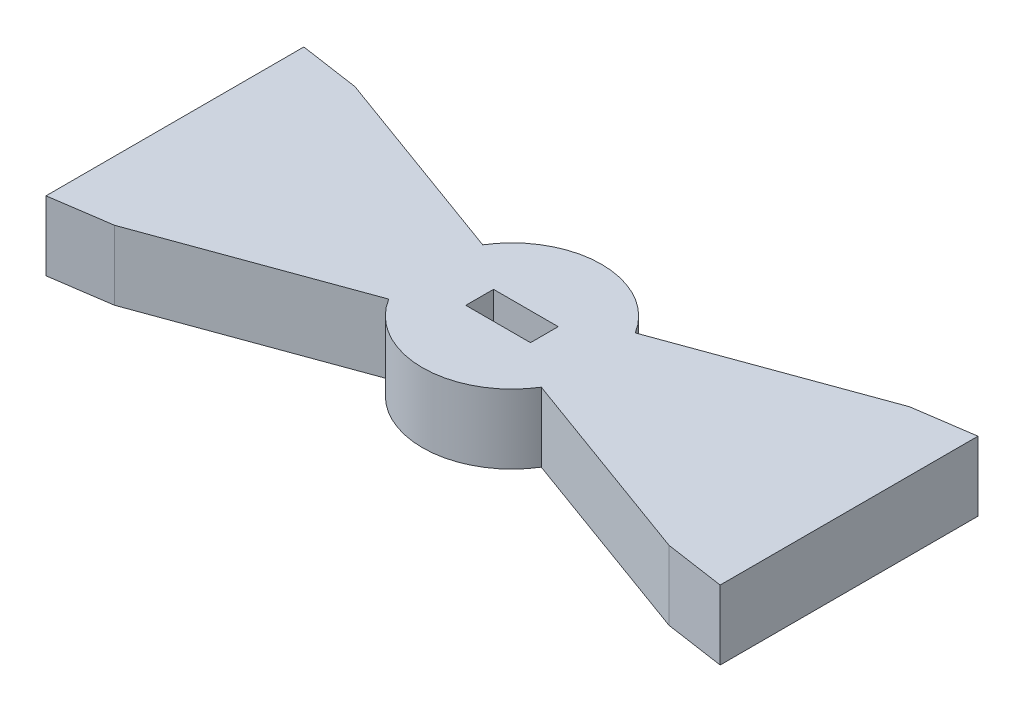
ISO-10303-21;
HEADER;
FILE_DESCRIPTION(('STEP AP214'),'2;1');
FILE_NAME('part.step','',(''),(''),'','','');
FILE_SCHEMA(('AUTOMOTIVE_DESIGN { 1 0 10303 214 1 1 1 1 }'));
ENDSEC;
DATA;
#1=APPLICATION_CONTEXT('core data for automotive mechanical design processes');
#2=APPLICATION_PROTOCOL_DEFINITION('international standard','automotive_design',2000,#1);
#3=PRODUCT_CONTEXT('',#1,'mechanical');
#4=PRODUCT('Part','Part','',(#3));
#5=PRODUCT_RELATED_PRODUCT_CATEGORY('part','',(#4));
#6=PRODUCT_DEFINITION_FORMATION('','',#4);
#7=PRODUCT_DEFINITION_CONTEXT('part definition',#1,'design');
#8=PRODUCT_DEFINITION('design','',#6,#7);
#9=PRODUCT_DEFINITION_SHAPE('','',#8);
#10=(LENGTH_UNIT() NAMED_UNIT(*) SI_UNIT(.MILLI.,.METRE.));
#11=(NAMED_UNIT(*) PLANE_ANGLE_UNIT() SI_UNIT($,.RADIAN.));
#12=(NAMED_UNIT(*) SI_UNIT($,.STERADIAN.) SOLID_ANGLE_UNIT());
#13=UNCERTAINTY_MEASURE_WITH_UNIT(LENGTH_MEASURE(1.E-05),#10,'distance_accuracy_value','');
#14=(GEOMETRIC_REPRESENTATION_CONTEXT(3) GLOBAL_UNCERTAINTY_ASSIGNED_CONTEXT((#13)) GLOBAL_UNIT_ASSIGNED_CONTEXT((#10,
#11,#12)) REPRESENTATION_CONTEXT('',''));
#15=CARTESIAN_POINT('',(0.,0.,0.));
#16=DIRECTION('',(0.,0.,1.));
#17=DIRECTION('',(1.,0.,0.));
#18=AXIS2_PLACEMENT_3D('',#15,#16,#17);
#19=CARTESIAN_POINT('',(0.169871671875798,1.905,0.466718582683769));
#20=DIRECTION('',(0.342020143325663,0.,0.939692620785911));
#21=DIRECTION('',(0.939692620785911,0.,-0.342020143325663));
#22=AXIS2_PLACEMENT_3D('',#19,#20,#21);
#23=PLANE('',#22);
#24=DIRECTION('',(-0.939692620785911,0.,0.342020143325663));
#25=VECTOR('',#24,1.);
#26=CARTESIAN_POINT('',(0.169871671875798,0.,0.466718582683769));
#27=LINE('',#26,#25);
#28=CARTESIAN_POINT('',(-2.09649020518056,0.,1.29160684600795));
#29=VERTEX_POINT('',#28);
#30=CARTESIAN_POINT('',(-7.62,0.,3.302));
#31=VERTEX_POINT('',#30);
#32=EDGE_CURVE('E185',#29,#31,#27,.T.);
#33=ORIENTED_EDGE('',*,*,#32,.F.);
#34=DIRECTION('',(0.,-1.,0.));
#35=VECTOR('',#34,1.);
#36=CARTESIAN_POINT('',(-2.09649020518056,1.905,1.29160684600795));
#37=LINE('',#36,#35);
#38=CARTESIAN_POINT('',(-2.09649020518056,1.905,1.29160684600795));
#39=VERTEX_POINT('',#38);
#40=EDGE_CURVE('E312',#39,#29,#37,.T.);
#41=ORIENTED_EDGE('',*,*,#40,.F.);
#42=DIRECTION('',(-0.939692620785911,0.,0.342020143325663));
#43=VECTOR('',#42,1.);
#44=CARTESIAN_POINT('',(0.169871671875798,1.905,0.466718582683769));
#45=LINE('',#44,#43);
#46=CARTESIAN_POINT('',(-7.62,1.905,3.302));
#47=VERTEX_POINT('',#46);
#48=EDGE_CURVE('E190',#39,#47,#45,.T.);
#49=ORIENTED_EDGE('',*,*,#48,.T.);
#50=DIRECTION('',(0.,-1.,0.));
#51=VECTOR('',#50,1.);
#52=CARTESIAN_POINT('',(-7.62,1.905,3.302));
#53=LINE('',#52,#51);
#54=EDGE_CURVE('E233',#47,#31,#53,.T.);
#55=ORIENTED_EDGE('',*,*,#54,.T.);
#56=EDGE_LOOP('',(#33,#41,#49,#55));
#57=FACE_BOUND('',#56,.T.);
#58=ADVANCED_FACE('F41',(#57),#23,.T.);
#59=CARTESIAN_POINT('',(0.,1.905,0.));
#60=DIRECTION('',(0.,-1.,0.));
#61=DIRECTION('',(0.,0.,-1.));
#62=AXIS2_PLACEMENT_3D('',#59,#60,#61);
#63=CYLINDRICAL_SURFACE('',#62,2.46242145561491);
#64=CARTESIAN_POINT('',(0.,0.,0.));
#65=DIRECTION('',(0.,1.,0.));
#66=DIRECTION('',(0.,0.,1.));
#67=AXIS2_PLACEMENT_3D('',#64,#65,#66);
#68=CIRCLE('',#67,2.46242145561491);
#69=CARTESIAN_POINT('',(2.09649020518056,0.,1.29160684600795));
#70=VERTEX_POINT('',#69);
#71=EDGE_CURVE('E237',#29,#70,#68,.T.);
#72=ORIENTED_EDGE('',*,*,#71,.T.);
#73=DIRECTION('',(0.,-1.,0.));
#74=VECTOR('',#73,1.);
#75=CARTESIAN_POINT('',(2.09649020518056,1.905,1.29160684600795));
#76=LINE('',#75,#74);
#77=CARTESIAN_POINT('',(2.09649020518056,1.905,1.29160684600795));
#78=VERTEX_POINT('',#77);
#79=EDGE_CURVE('E308',#78,#70,#76,.T.);
#80=ORIENTED_EDGE('',*,*,#79,.F.);
#81=CARTESIAN_POINT('',(0.,1.905,0.));
#82=DIRECTION('',(0.,1.,0.));
#83=DIRECTION('',(0.,0.,1.));
#84=AXIS2_PLACEMENT_3D('',#81,#82,#83);
#85=CIRCLE('',#84,2.46242145561491);
#86=EDGE_CURVE('E194',#39,#78,#85,.T.);
#87=ORIENTED_EDGE('',*,*,#86,.F.);
#88=ORIENTED_EDGE('',*,*,#40,.T.);
#89=EDGE_LOOP('',(#72,#80,#87,#88));
#90=FACE_BOUND('',#89,.T.);
#91=ADVANCED_FACE('F339',(#90),#63,.T.);
#92=CARTESIAN_POINT('',(-0.169871671875798,1.905,0.466718582683769));
#93=DIRECTION('',(0.342020143325663,0.,-0.939692620785911));
#94=DIRECTION('',(-0.939692620785911,0.,-0.342020143325663));
#95=AXIS2_PLACEMENT_3D('',#92,#93,#94);
#96=PLANE('',#95);
#97=DIRECTION('',(0.939692620785911,0.,0.342020143325663));
#98=VECTOR('',#97,1.);
#99=CARTESIAN_POINT('',(-0.169871671875798,0.,0.466718582683769));
#100=LINE('',#99,#98);
#101=CARTESIAN_POINT('',(7.62,0.,3.302));
#102=VERTEX_POINT('',#101);
#103=EDGE_CURVE('E240',#70,#102,#100,.T.);
#104=ORIENTED_EDGE('',*,*,#103,.T.);
#105=DIRECTION('',(0.,-1.,0.));
#106=VECTOR('',#105,1.);
#107=CARTESIAN_POINT('',(7.62,1.905,3.302));
#108=LINE('',#107,#106);
#109=CARTESIAN_POINT('',(7.62,1.905,3.302));
#110=VERTEX_POINT('',#109);
#111=EDGE_CURVE('E304',#110,#102,#108,.T.);
#112=ORIENTED_EDGE('',*,*,#111,.F.);
#113=DIRECTION('',(0.939692620785911,0.,0.342020143325663));
#114=VECTOR('',#113,1.);
#115=CARTESIAN_POINT('',(-0.169871671875798,1.905,0.466718582683769));
#116=LINE('',#115,#114);
#117=EDGE_CURVE('E198',#78,#110,#116,.T.);
#118=ORIENTED_EDGE('',*,*,#117,.F.);
#119=ORIENTED_EDGE('',*,*,#79,.T.);
#120=EDGE_LOOP('',(#104,#112,#118,#119));
#121=FACE_BOUND('',#120,.T.);
#122=ADVANCED_FACE('F344',(#121),#96,.F.);
#123=CARTESIAN_POINT('',(-0.31384759584138,1.905,2.13657389373119));
#124=DIRECTION('',(0.145333329194699,0.,-0.989382748700009));
#125=DIRECTION('',(-0.989382748700009,0.,-0.145333329194699));
#126=AXIS2_PLACEMENT_3D('',#123,#124,#125);
#127=PLANE('',#126);
#128=DIRECTION('',(0.989382748700009,0.,0.145333329194699));
#129=VECTOR('',#128,1.);
#130=CARTESIAN_POINT('',(-0.31384759584138,0.,2.13657389373119));
#131=LINE('',#130,#129);
#132=CARTESIAN_POINT('',(9.2654017996594,0.,3.54369788862971));
#133=VERTEX_POINT('',#132);
#134=EDGE_CURVE('E243',#102,#133,#131,.T.);
#135=ORIENTED_EDGE('',*,*,#134,.T.);
#136=DIRECTION('',(0.,-1.,0.));
#137=VECTOR('',#136,1.);
#138=CARTESIAN_POINT('',(9.2654017996594,1.905,3.54369788862971));
#139=LINE('',#138,#137);
#140=CARTESIAN_POINT('',(9.2654017996594,1.905,3.54369788862971));
#141=VERTEX_POINT('',#140);
#142=EDGE_CURVE('E301',#141,#133,#139,.T.);
#143=ORIENTED_EDGE('',*,*,#142,.F.);
#144=DIRECTION('',(0.989382748700009,0.,0.145333329194699));
#145=VECTOR('',#144,1.);
#146=CARTESIAN_POINT('',(-0.31384759584138,1.905,2.13657389373119));
#147=LINE('',#146,#145);
#148=EDGE_CURVE('E201',#110,#141,#147,.T.);
#149=ORIENTED_EDGE('',*,*,#148,.F.);
#150=ORIENTED_EDGE('',*,*,#111,.T.);
#151=EDGE_LOOP('',(#135,#143,#149,#150));
#152=FACE_BOUND('',#151,.T.);
#153=ADVANCED_FACE('F388',(#152),#127,.F.);
#154=CARTESIAN_POINT('',(9.2654017996594,1.905,0.));
#155=DIRECTION('',(1.,0.,0.));
#156=DIRECTION('',(0.,0.,-1.));
#157=AXIS2_PLACEMENT_3D('',#154,#155,#156);
#158=PLANE('',#157);
#159=DIRECTION('',(0.,0.,1.));
#160=VECTOR('',#159,1.);
#161=CARTESIAN_POINT('',(9.2654017996594,0.,0.));
#162=LINE('',#161,#160);
#163=CARTESIAN_POINT('',(9.2654017996594,0.,-3.54369788862971));
#164=VERTEX_POINT('',#163);
#165=EDGE_CURVE('E247',#164,#133,#162,.T.);
#166=ORIENTED_EDGE('',*,*,#165,.F.);
#167=DIRECTION('',(0.,-1.,0.));
#168=VECTOR('',#167,1.);
#169=CARTESIAN_POINT('',(9.2654017996594,1.905,-3.54369788862971));
#170=LINE('',#169,#168);
#171=CARTESIAN_POINT('',(9.2654017996594,1.905,-3.54369788862971));
#172=VERTEX_POINT('',#171);
#173=EDGE_CURVE('E298',#172,#164,#170,.T.);
#174=ORIENTED_EDGE('',*,*,#173,.F.);
#175=DIRECTION('',(0.,0.,1.));
#176=VECTOR('',#175,1.);
#177=CARTESIAN_POINT('',(9.2654017996594,1.905,0.));
#178=LINE('',#177,#176);
#179=EDGE_CURVE('E204',#172,#141,#178,.T.);
#180=ORIENTED_EDGE('',*,*,#179,.T.);
#181=ORIENTED_EDGE('',*,*,#142,.T.);
#182=EDGE_LOOP('',(#166,#174,#180,#181));
#183=FACE_BOUND('',#182,.T.);
#184=ADVANCED_FACE('F384',(#183),#158,.T.);
#185=CARTESIAN_POINT('',(-0.31384759584138,1.905,-2.13657389373119));
#186=DIRECTION('',(-0.145333329194699,0.,-0.989382748700009));
#187=DIRECTION('',(-0.989382748700009,0.,0.145333329194699));
#188=AXIS2_PLACEMENT_3D('',#185,#186,#187);
#189=PLANE('',#188);
#190=DIRECTION('',(0.989382748700009,0.,-0.145333329194699));
#191=VECTOR('',#190,1.);
#192=CARTESIAN_POINT('',(-0.31384759584138,0.,-2.13657389373119));
#193=LINE('',#192,#191);
#194=CARTESIAN_POINT('',(7.62,0.,-3.302));
#195=VERTEX_POINT('',#194);
#196=EDGE_CURVE('E251',#195,#164,#193,.T.);
#197=ORIENTED_EDGE('',*,*,#196,.F.);
#198=DIRECTION('',(0.,-1.,0.));
#199=VECTOR('',#198,1.);
#200=CARTESIAN_POINT('',(7.62,1.905,-3.302));
#201=LINE('',#200,#199);
#202=CARTESIAN_POINT('',(7.62,1.905,-3.302));
#203=VERTEX_POINT('',#202);
#204=EDGE_CURVE('E295',#203,#195,#201,.T.);
#205=ORIENTED_EDGE('',*,*,#204,.F.);
#206=DIRECTION('',(0.989382748700009,0.,-0.145333329194699));
#207=VECTOR('',#206,1.);
#208=CARTESIAN_POINT('',(-0.31384759584138,1.905,-2.13657389373119));
#209=LINE('',#208,#207);
#210=EDGE_CURVE('E208',#203,#172,#209,.T.);
#211=ORIENTED_EDGE('',*,*,#210,.T.);
#212=ORIENTED_EDGE('',*,*,#173,.T.);
#213=EDGE_LOOP('',(#197,#205,#211,#212));
#214=FACE_BOUND('',#213,.T.);
#215=ADVANCED_FACE('F380',(#214),#189,.T.);
#216=CARTESIAN_POINT('',(-0.169871671875798,1.905,-0.466718582683769));
#217=DIRECTION('',(-0.342020143325663,0.,-0.939692620785911));
#218=DIRECTION('',(-0.939692620785911,0.,0.342020143325663));
#219=AXIS2_PLACEMENT_3D('',#216,#217,#218);
#220=PLANE('',#219);
#221=DIRECTION('',(0.939692620785911,0.,-0.342020143325663));
#222=VECTOR('',#221,1.);
#223=CARTESIAN_POINT('',(-0.169871671875798,0.,-0.466718582683769));
#224=LINE('',#223,#222);
#225=CARTESIAN_POINT('',(2.09649020518056,0.,-1.29160684600795));
#226=VERTEX_POINT('',#225);
#227=EDGE_CURVE('E255',#226,#195,#224,.T.);
#228=ORIENTED_EDGE('',*,*,#227,.F.);
#229=DIRECTION('',(0.,-1.,0.));
#230=VECTOR('',#229,1.);
#231=CARTESIAN_POINT('',(2.09649020518056,1.905,-1.29160684600795));
#232=LINE('',#231,#230);
#233=CARTESIAN_POINT('',(2.09649020518056,1.905,-1.29160684600795));
#234=VERTEX_POINT('',#233);
#235=EDGE_CURVE('E292',#234,#226,#232,.T.);
#236=ORIENTED_EDGE('',*,*,#235,.F.);
#237=DIRECTION('',(0.939692620785911,0.,-0.342020143325663));
#238=VECTOR('',#237,1.);
#239=CARTESIAN_POINT('',(-0.169871671875798,1.905,-0.466718582683769));
#240=LINE('',#239,#238);
#241=EDGE_CURVE('E212',#234,#203,#240,.T.);
#242=ORIENTED_EDGE('',*,*,#241,.T.);
#243=ORIENTED_EDGE('',*,*,#204,.T.);
#244=EDGE_LOOP('',(#228,#236,#242,#243));
#245=FACE_BOUND('',#244,.T.);
#246=ADVANCED_FACE('F376',(#245),#220,.T.);
#247=CARTESIAN_POINT('',(0.,1.905,0.));
#248=DIRECTION('',(0.,-1.,0.));
#249=DIRECTION('',(0.,0.,-1.));
#250=AXIS2_PLACEMENT_3D('',#247,#248,#249);
#251=CYLINDRICAL_SURFACE('',#250,2.46242145561491);
#252=CARTESIAN_POINT('',(0.,0.,0.));
#253=DIRECTION('',(0.,1.,0.));
#254=DIRECTION('',(0.,0.,1.));
#255=AXIS2_PLACEMENT_3D('',#252,#253,#254);
#256=CIRCLE('',#255,2.46242145561491);
#257=CARTESIAN_POINT('',(-2.09649020518056,0.,-1.29160684600795));
#258=VERTEX_POINT('',#257);
#259=EDGE_CURVE('E259',#258,#226,#256,.F.);
#260=ORIENTED_EDGE('',*,*,#259,.F.);
#261=DIRECTION('',(0.,-1.,0.));
#262=VECTOR('',#261,1.);
#263=CARTESIAN_POINT('',(-2.09649020518056,1.905,-1.29160684600795));
#264=LINE('',#263,#262);
#265=CARTESIAN_POINT('',(-2.09649020518056,1.905,-1.29160684600795));
#266=VERTEX_POINT('',#265);
#267=EDGE_CURVE('E289',#266,#258,#264,.T.);
#268=ORIENTED_EDGE('',*,*,#267,.F.);
#269=CARTESIAN_POINT('',(0.,1.905,0.));
#270=DIRECTION('',(0.,1.,0.));
#271=DIRECTION('',(0.,0.,1.));
#272=AXIS2_PLACEMENT_3D('',#269,#270,#271);
#273=CIRCLE('',#272,2.46242145561491);
#274=EDGE_CURVE('E216',#266,#234,#273,.F.);
#275=ORIENTED_EDGE('',*,*,#274,.T.);
#276=ORIENTED_EDGE('',*,*,#235,.T.);
#277=EDGE_LOOP('',(#260,#268,#275,#276));
#278=FACE_BOUND('',#277,.T.);
#279=ADVANCED_FACE('F372',(#278),#251,.T.);
#280=CARTESIAN_POINT('',(0.169871671875798,1.905,-0.466718582683769));
#281=DIRECTION('',(-0.342020143325663,0.,0.939692620785911));
#282=DIRECTION('',(0.939692620785911,0.,0.342020143325663));
#283=AXIS2_PLACEMENT_3D('',#280,#281,#282);
#284=PLANE('',#283);
#285=DIRECTION('',(-0.939692620785911,0.,-0.342020143325663));
#286=VECTOR('',#285,1.);
#287=CARTESIAN_POINT('',(0.169871671875798,0.,-0.466718582683769));
#288=LINE('',#287,#286);
#289=CARTESIAN_POINT('',(-7.62,0.,-3.302));
#290=VERTEX_POINT('',#289);
#291=EDGE_CURVE('E263',#258,#290,#288,.T.);
#292=ORIENTED_EDGE('',*,*,#291,.T.);
#293=DIRECTION('',(0.,-1.,0.));
#294=VECTOR('',#293,1.);
#295=CARTESIAN_POINT('',(-7.62,1.905,-3.302));
#296=LINE('',#295,#294);
#297=CARTESIAN_POINT('',(-7.62,1.905,-3.302));
#298=VERTEX_POINT('',#297);
#299=EDGE_CURVE('E285',#298,#290,#296,.T.);
#300=ORIENTED_EDGE('',*,*,#299,.F.);
#301=DIRECTION('',(-0.939692620785911,0.,-0.342020143325663));
#302=VECTOR('',#301,1.);
#303=CARTESIAN_POINT('',(0.169871671875798,1.905,-0.466718582683769));
#304=LINE('',#303,#302);
#305=EDGE_CURVE('E220',#266,#298,#304,.T.);
#306=ORIENTED_EDGE('',*,*,#305,.F.);
#307=ORIENTED_EDGE('',*,*,#267,.T.);
#308=EDGE_LOOP('',(#292,#300,#306,#307));
#309=FACE_BOUND('',#308,.T.);
#310=ADVANCED_FACE('F369',(#309),#284,.F.);
#311=CARTESIAN_POINT('',(0.313847595841379,1.905,-2.1365738937312));
#312=DIRECTION('',(-0.145333329194698,0.,0.989382748700009));
#313=DIRECTION('',(0.989382748700009,0.,0.145333329194698));
#314=AXIS2_PLACEMENT_3D('',#311,#312,#313);
#315=PLANE('',#314);
#316=DIRECTION('',(-0.989382748700009,0.,-0.145333329194698));
#317=VECTOR('',#316,1.);
#318=CARTESIAN_POINT('',(0.313847595841379,0.,-2.1365738937312));
#319=LINE('',#318,#317);
#320=CARTESIAN_POINT('',(-9.2654017996594,0.,-3.54369788862971));
#321=VERTEX_POINT('',#320);
#322=EDGE_CURVE('E266',#290,#321,#319,.T.);
#323=ORIENTED_EDGE('',*,*,#322,.T.);
#324=DIRECTION('',(0.,-1.,0.));
#325=VECTOR('',#324,1.);
#326=CARTESIAN_POINT('',(-9.2654017996594,1.905,-3.54369788862971));
#327=LINE('',#326,#325);
#328=CARTESIAN_POINT('',(-9.2654017996594,1.905,-3.54369788862971));
#329=VERTEX_POINT('',#328);
#330=EDGE_CURVE('E281',#329,#321,#327,.T.);
#331=ORIENTED_EDGE('',*,*,#330,.F.);
#332=DIRECTION('',(-0.989382748700009,0.,-0.145333329194698));
#333=VECTOR('',#332,1.);
#334=CARTESIAN_POINT('',(0.313847595841379,1.905,-2.1365738937312));
#335=LINE('',#334,#333);
#336=EDGE_CURVE('E223',#298,#329,#335,.T.);
#337=ORIENTED_EDGE('',*,*,#336,.F.);
#338=ORIENTED_EDGE('',*,*,#299,.T.);
#339=EDGE_LOOP('',(#323,#331,#337,#338));
#340=FACE_BOUND('',#339,.T.);
#341=ADVANCED_FACE('F364',(#340),#315,.F.);
#342=CARTESIAN_POINT('',(-9.2654017996594,1.905,0.));
#343=DIRECTION('',(1.,0.,0.));
#344=DIRECTION('',(0.,0.,-1.));
#345=AXIS2_PLACEMENT_3D('',#342,#343,#344);
#346=PLANE('',#345);
#347=DIRECTION('',(0.,0.,1.));
#348=VECTOR('',#347,1.);
#349=CARTESIAN_POINT('',(-9.2654017996594,0.,0.));
#350=LINE('',#349,#348);
#351=CARTESIAN_POINT('',(-9.2654017996594,0.,3.54369788862971));
#352=VERTEX_POINT('',#351);
#353=EDGE_CURVE('E269',#321,#352,#350,.T.);
#354=ORIENTED_EDGE('',*,*,#353,.T.);
#355=DIRECTION('',(0.,-1.,0.));
#356=VECTOR('',#355,1.);
#357=CARTESIAN_POINT('',(-9.2654017996594,1.905,3.54369788862971));
#358=LINE('',#357,#356);
#359=CARTESIAN_POINT('',(-9.2654017996594,1.905,3.54369788862971));
#360=VERTEX_POINT('',#359);
#361=EDGE_CURVE('E278',#360,#352,#358,.T.);
#362=ORIENTED_EDGE('',*,*,#361,.F.);
#363=DIRECTION('',(0.,0.,1.));
#364=VECTOR('',#363,1.);
#365=CARTESIAN_POINT('',(-9.2654017996594,1.905,0.));
#366=LINE('',#365,#364);
#367=EDGE_CURVE('E226',#329,#360,#366,.T.);
#368=ORIENTED_EDGE('',*,*,#367,.F.);
#369=ORIENTED_EDGE('',*,*,#330,.T.);
#370=EDGE_LOOP('',(#354,#362,#368,#369));
#371=FACE_BOUND('',#370,.T.);
#372=ADVANCED_FACE('F358',(#371),#346,.F.);
#373=CARTESIAN_POINT('',(0.313847595841379,1.905,2.1365738937312));
#374=DIRECTION('',(0.145333329194698,0.,0.989382748700009));
#375=DIRECTION('',(0.989382748700009,0.,-0.145333329194698));
#376=AXIS2_PLACEMENT_3D('',#373,#374,#375);
#377=PLANE('',#376);
#378=DIRECTION('',(-0.989382748700009,0.,0.145333329194698));
#379=VECTOR('',#378,1.);
#380=CARTESIAN_POINT('',(0.313847595841379,0.,2.1365738937312));
#381=LINE('',#380,#379);
#382=EDGE_CURVE('E195',#31,#352,#381,.T.);
#383=ORIENTED_EDGE('',*,*,#382,.F.);
#384=ORIENTED_EDGE('',*,*,#54,.F.);
#385=DIRECTION('',(-0.989382748700009,0.,0.145333329194698));
#386=VECTOR('',#385,1.);
#387=CARTESIAN_POINT('',(0.313847595841379,1.905,2.1365738937312));
#388=LINE('',#387,#386);
#389=EDGE_CURVE('E229',#47,#360,#388,.T.);
#390=ORIENTED_EDGE('',*,*,#389,.T.);
#391=ORIENTED_EDGE('',*,*,#361,.T.);
#392=EDGE_LOOP('',(#383,#384,#390,#391));
#393=FACE_BOUND('',#392,.T.);
#394=ADVANCED_FACE('F353',(#393),#377,.T.);
#395=CARTESIAN_POINT('',(0.,1.905,0.));
#396=DIRECTION('',(0.,1.,0.));
#397=DIRECTION('',(0.,0.,1.));
#398=AXIS2_PLACEMENT_3D('',#395,#396,#397);
#399=PLANE('',#398);
#400=DIRECTION('',(0.,0.,-1.));
#401=VECTOR('',#400,1.);
#402=CARTESIAN_POINT('',(0.889,1.905,0.381));
#403=LINE('',#402,#401);
#404=CARTESIAN_POINT('',(0.889,1.905,0.381));
#405=VERTEX_POINT('',#404);
#406=CARTESIAN_POINT('',(0.889,1.905,-0.381));
#407=VERTEX_POINT('',#406);
#408=EDGE_CURVE('E56',#405,#407,#403,.T.);
#409=ORIENTED_EDGE('',*,*,#408,.F.);
#410=DIRECTION('',(1.,0.,0.));
#411=VECTOR('',#410,1.);
#412=CARTESIAN_POINT('',(-0.889,1.905,0.381));
#413=LINE('',#412,#411);
#414=CARTESIAN_POINT('',(-0.889,1.905,0.381));
#415=VERTEX_POINT('',#414);
#416=EDGE_CURVE('E175',#415,#405,#413,.T.);
#417=ORIENTED_EDGE('',*,*,#416,.F.);
#418=DIRECTION('',(0.,0.,1.));
#419=VECTOR('',#418,1.);
#420=CARTESIAN_POINT('',(-0.889,1.905,0.381));
#421=LINE('',#420,#419);
#422=CARTESIAN_POINT('',(-0.889,1.905,-0.381));
#423=VERTEX_POINT('',#422);
#424=EDGE_CURVE('E157',#423,#415,#421,.T.);
#425=ORIENTED_EDGE('',*,*,#424,.F.);
#426=DIRECTION('',(-1.,0.,0.));
#427=VECTOR('',#426,1.);
#428=CARTESIAN_POINT('',(-0.889,1.905,-0.381));
#429=LINE('',#428,#427);
#430=EDGE_CURVE('E167',#407,#423,#429,.T.);
#431=ORIENTED_EDGE('',*,*,#430,.F.);
#432=EDGE_LOOP('',(#409,#417,#425,#431));
#433=FACE_BOUND('',#432,.T.);
#434=ORIENTED_EDGE('',*,*,#48,.F.);
#435=ORIENTED_EDGE('',*,*,#86,.T.);
#436=ORIENTED_EDGE('',*,*,#117,.T.);
#437=ORIENTED_EDGE('',*,*,#148,.T.);
#438=ORIENTED_EDGE('',*,*,#179,.F.);
#439=ORIENTED_EDGE('',*,*,#210,.F.);
#440=ORIENTED_EDGE('',*,*,#241,.F.);
#441=ORIENTED_EDGE('',*,*,#274,.F.);
#442=ORIENTED_EDGE('',*,*,#305,.T.);
#443=ORIENTED_EDGE('',*,*,#336,.T.);
#444=ORIENTED_EDGE('',*,*,#367,.T.);
#445=ORIENTED_EDGE('',*,*,#389,.F.);
#446=EDGE_LOOP('',(#434,#435,#436,#437,#438,#439,#440,#441,#442,#443,#444,#445));
#447=FACE_BOUND('',#446,.T.);
#448=ADVANCED_FACE('F172',(#433,#447),#399,.T.);
#449=CARTESIAN_POINT('',(0.,0.,0.));
#450=DIRECTION('',(0.,1.,0.));
#451=DIRECTION('',(0.,0.,1.));
#452=AXIS2_PLACEMENT_3D('',#449,#450,#451);
#453=PLANE('',#452);
#454=DIRECTION('',(1.,0.,0.));
#455=VECTOR('',#454,1.);
#456=CARTESIAN_POINT('',(0.,0.,0.381));
#457=LINE('',#456,#455);
#458=CARTESIAN_POINT('',(-0.889,0.,0.381));
#459=VERTEX_POINT('',#458);
#460=CARTESIAN_POINT('',(0.889,0.,0.381));
#461=VERTEX_POINT('',#460);
#462=EDGE_CURVE('E49',#459,#461,#457,.T.);
#463=ORIENTED_EDGE('',*,*,#462,.T.);
#464=DIRECTION('',(0.,0.,-1.));
#465=VECTOR('',#464,1.);
#466=CARTESIAN_POINT('',(0.889,0.,0.));
#467=LINE('',#466,#465);
#468=CARTESIAN_POINT('',(0.889,0.,-0.381));
#469=VERTEX_POINT('',#468);
#470=EDGE_CURVE('E11',#461,#469,#467,.T.);
#471=ORIENTED_EDGE('',*,*,#470,.T.);
#472=DIRECTION('',(-1.,0.,0.));
#473=VECTOR('',#472,1.);
#474=CARTESIAN_POINT('',(0.,0.,-0.381));
#475=LINE('',#474,#473);
#476=CARTESIAN_POINT('',(-0.889,0.,-0.381));
#477=VERTEX_POINT('',#476);
#478=EDGE_CURVE('E315',#469,#477,#475,.T.);
#479=ORIENTED_EDGE('',*,*,#478,.T.);
#480=DIRECTION('',(0.,0.,1.));
#481=VECTOR('',#480,1.);
#482=CARTESIAN_POINT('',(-0.889,0.,0.));
#483=LINE('',#482,#481);
#484=EDGE_CURVE('E160',#477,#459,#483,.T.);
#485=ORIENTED_EDGE('',*,*,#484,.T.);
#486=EDGE_LOOP('',(#463,#471,#479,#485));
#487=FACE_BOUND('',#486,.T.);
#488=ORIENTED_EDGE('',*,*,#32,.T.);
#489=ORIENTED_EDGE('',*,*,#382,.T.);
#490=ORIENTED_EDGE('',*,*,#353,.F.);
#491=ORIENTED_EDGE('',*,*,#322,.F.);
#492=ORIENTED_EDGE('',*,*,#291,.F.);
#493=ORIENTED_EDGE('',*,*,#259,.T.);
#494=ORIENTED_EDGE('',*,*,#227,.T.);
#495=ORIENTED_EDGE('',*,*,#196,.T.);
#496=ORIENTED_EDGE('',*,*,#165,.T.);
#497=ORIENTED_EDGE('',*,*,#134,.F.);
#498=ORIENTED_EDGE('',*,*,#103,.F.);
#499=ORIENTED_EDGE('',*,*,#71,.F.);
#500=EDGE_LOOP('',(#488,#489,#490,#491,#492,#493,#494,#495,#496,#497,#498,#499));
#501=FACE_BOUND('',#500,.T.);
#502=ADVANCED_FACE('F322',(#487,#501),#453,.F.);
#503=CARTESIAN_POINT('',(0.889,-0.635,0.381));
#504=DIRECTION('',(1.,0.,0.));
#505=DIRECTION('',(0.,0.,-1.));
#506=AXIS2_PLACEMENT_3D('',#503,#504,#505);
#507=PLANE('',#506);
#508=DIRECTION('',(0.,1.,0.));
#509=VECTOR('',#508,1.);
#510=CARTESIAN_POINT('',(0.889,-0.635,0.381));
#511=LINE('',#510,#509);
#512=EDGE_CURVE('E182',#461,#405,#511,.T.);
#513=ORIENTED_EDGE('',*,*,#512,.T.);
#514=ORIENTED_EDGE('',*,*,#408,.T.);
#515=DIRECTION('',(0.,1.,0.));
#516=VECTOR('',#515,1.);
#517=CARTESIAN_POINT('',(0.889,-0.635,-0.381));
#518=LINE('',#517,#516);
#519=EDGE_CURVE('E164',#469,#407,#518,.T.);
#520=ORIENTED_EDGE('',*,*,#519,.F.);
#521=ORIENTED_EDGE('',*,*,#470,.F.);
#522=EDGE_LOOP('',(#513,#514,#520,#521));
#523=FACE_BOUND('',#522,.T.);
#524=ADVANCED_FACE('F327',(#523),#507,.F.);
#525=CARTESIAN_POINT('',(-0.889,-0.635,0.381));
#526=DIRECTION('',(0.,0.,1.));
#527=DIRECTION('',(1.,0.,0.));
#528=AXIS2_PLACEMENT_3D('',#525,#526,#527);
#529=PLANE('',#528);
#530=DIRECTION('',(0.,1.,0.));
#531=VECTOR('',#530,1.);
#532=CARTESIAN_POINT('',(-0.889,-0.635,0.381));
#533=LINE('',#532,#531);
#534=EDGE_CURVE('E163',#459,#415,#533,.T.);
#535=ORIENTED_EDGE('',*,*,#534,.T.);
#536=ORIENTED_EDGE('',*,*,#416,.T.);
#537=ORIENTED_EDGE('',*,*,#512,.F.);
#538=ORIENTED_EDGE('',*,*,#462,.F.);
#539=EDGE_LOOP('',(#535,#536,#537,#538));
#540=FACE_BOUND('',#539,.T.);
#541=ADVANCED_FACE('F326',(#540),#529,.F.);
#542=CARTESIAN_POINT('',(-0.889,-0.635,0.381));
#543=DIRECTION('',(-1.,0.,0.));
#544=DIRECTION('',(0.,0.,1.));
#545=AXIS2_PLACEMENT_3D('',#542,#543,#544);
#546=PLANE('',#545);
#547=DIRECTION('',(0.,1.,0.));
#548=VECTOR('',#547,1.);
#549=CARTESIAN_POINT('',(-0.889,-0.635,-0.381));
#550=LINE('',#549,#548);
#551=EDGE_CURVE('E64',#477,#423,#550,.T.);
#552=ORIENTED_EDGE('',*,*,#551,.T.);
#553=ORIENTED_EDGE('',*,*,#424,.T.);
#554=ORIENTED_EDGE('',*,*,#534,.F.);
#555=ORIENTED_EDGE('',*,*,#484,.F.);
#556=EDGE_LOOP('',(#552,#553,#554,#555));
#557=FACE_BOUND('',#556,.T.);
#558=ADVANCED_FACE('F154',(#557),#546,.F.);
#559=CARTESIAN_POINT('',(-0.889,-0.635,-0.381));
#560=DIRECTION('',(0.,0.,-1.));
#561=DIRECTION('',(-1.,0.,0.));
#562=AXIS2_PLACEMENT_3D('',#559,#560,#561);
#563=PLANE('',#562);
#564=ORIENTED_EDGE('',*,*,#519,.T.);
#565=ORIENTED_EDGE('',*,*,#430,.T.);
#566=ORIENTED_EDGE('',*,*,#551,.F.);
#567=ORIENTED_EDGE('',*,*,#478,.F.);
#568=EDGE_LOOP('',(#564,#565,#566,#567));
#569=FACE_BOUND('',#568,.T.);
#570=ADVANCED_FACE('F168',(#569),#563,.F.);
#571=CLOSED_SHELL('',(#58,#91,#122,#153,#184,#215,#246,#279,#310,#341,#372,#394,#448,#502,#524,
#541,#558,#570));
#572=MANIFOLD_SOLID_BREP('B2',#571);
#573=ADVANCED_BREP_SHAPE_REPRESENTATION('',(#18,#572),#14);
#574=SHAPE_DEFINITION_REPRESENTATION(#9,#573);
ENDSEC;
END-ISO-10303-21;
